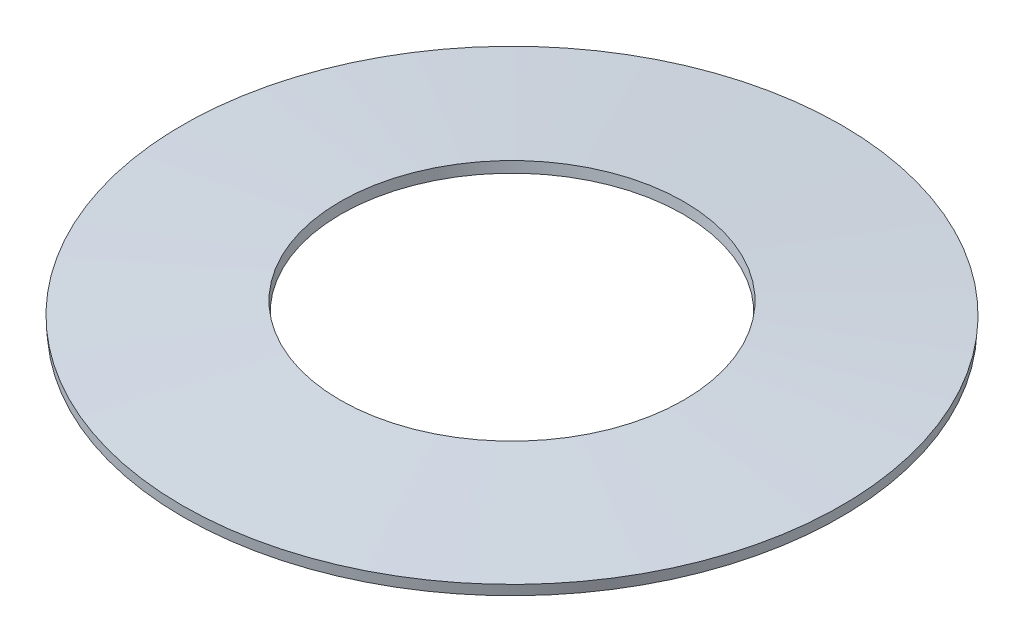
ISO-10303-21;
HEADER;
FILE_DESCRIPTION(('STEP AP214'),'2;1');
FILE_NAME('part.step','',(''),(''),'','','');
FILE_SCHEMA(('AUTOMOTIVE_DESIGN { 1 0 10303 214 1 1 1 1 }'));
ENDSEC;
DATA;
#1=APPLICATION_CONTEXT('core data for automotive mechanical design processes');
#2=APPLICATION_PROTOCOL_DEFINITION('international standard','automotive_design',2000,#1);
#3=PRODUCT_CONTEXT('',#1,'mechanical');
#4=PRODUCT('Part','Part','',(#3));
#5=PRODUCT_RELATED_PRODUCT_CATEGORY('part','',(#4));
#6=PRODUCT_DEFINITION_FORMATION('','',#4);
#7=PRODUCT_DEFINITION_CONTEXT('part definition',#1,'design');
#8=PRODUCT_DEFINITION('design','',#6,#7);
#9=PRODUCT_DEFINITION_SHAPE('','',#8);
#10=(LENGTH_UNIT() NAMED_UNIT(*) SI_UNIT(.MILLI.,.METRE.));
#11=(NAMED_UNIT(*) PLANE_ANGLE_UNIT() SI_UNIT($,.RADIAN.));
#12=(NAMED_UNIT(*) SI_UNIT($,.STERADIAN.) SOLID_ANGLE_UNIT());
#13=UNCERTAINTY_MEASURE_WITH_UNIT(LENGTH_MEASURE(1.E-05),#10,'distance_accuracy_value','');
#14=(GEOMETRIC_REPRESENTATION_CONTEXT(3) GLOBAL_UNCERTAINTY_ASSIGNED_CONTEXT((#13)) GLOBAL_UNIT_ASSIGNED_CONTEXT((#10,
#11,#12)) REPRESENTATION_CONTEXT('',''));
#15=CARTESIAN_POINT('',(0.,0.,0.));
#16=DIRECTION('',(0.,0.,1.));
#17=DIRECTION('',(1.,0.,0.));
#18=AXIS2_PLACEMENT_3D('',#15,#16,#17);
#19=CARTESIAN_POINT('',(0.,0.,0.));
#20=DIRECTION('',(0.,1.,0.));
#21=DIRECTION('',(0.,0.,1.));
#22=AXIS2_PLACEMENT_3D('',#19,#20,#21);
#23=CONICAL_SURFACE('',#22,7.88017020627382,0.0794025844507323);
#24=CARTESIAN_POINT('',(0.,0.249212317674661,0.));
#25=DIRECTION('',(0.,-1.,0.));
#26=DIRECTION('',(0.,0.,-1.));
#27=AXIS2_PLACEMENT_3D('',#24,#25,#26);
#28=CIRCLE('',#27,7.9);
#29=CARTESIAN_POINT('',(0.,0.249212317674661,-7.9));
#30=VERTEX_POINT('',#29);
#31=EDGE_CURVE('E48',#30,#30,#28,.T.);
#32=ORIENTED_EDGE('',*,*,#31,.T.);
#33=EDGE_LOOP('',(#32));
#34=FACE_BOUND('',#33,.T.);
#35=CARTESIAN_POINT('',(0.,0.,0.));
#36=DIRECTION('',(0.,-1.,0.));
#37=DIRECTION('',(0.,0.,-1.));
#38=AXIS2_PLACEMENT_3D('',#35,#36,#37);
#39=CIRCLE('',#38,7.88017020627382);
#40=CARTESIAN_POINT('',(0.,0.,-7.88017020627382));
#41=VERTEX_POINT('',#40);
#42=EDGE_CURVE('E10',#41,#41,#39,.T.);
#43=ORIENTED_EDGE('',*,*,#42,.F.);
#44=EDGE_LOOP('',(#43));
#45=FACE_BOUND('',#44,.T.);
#46=ADVANCED_FACE('F34',(#34,#45),#23,.T.);
#47=CARTESIAN_POINT('',(0.,0.300787682325335,0.));
#48=DIRECTION('',(0.,-1.,0.));
#49=DIRECTION('',(0.,0.,-1.));
#50=AXIS2_PLACEMENT_3D('',#47,#48,#49);
#51=CONICAL_SURFACE('',#50,4.1,1.49139374234414);
#52=ORIENTED_EDGE('',*,*,#42,.T.);
#53=EDGE_LOOP('',(#52));
#54=FACE_BOUND('',#53,.T.);
#55=CARTESIAN_POINT('',(0.,0.300787682325335,0.));
#56=DIRECTION('',(0.,-1.,0.));
#57=DIRECTION('',(0.,0.,-1.));
#58=AXIS2_PLACEMENT_3D('',#55,#56,#57);
#59=CIRCLE('',#58,4.1);
#60=CARTESIAN_POINT('',(0.,0.300787682325335,-4.1));
#61=VERTEX_POINT('',#60);
#62=EDGE_CURVE('E40',#61,#61,#59,.T.);
#63=ORIENTED_EDGE('',*,*,#62,.F.);
#64=EDGE_LOOP('',(#63));
#65=FACE_BOUND('',#64,.T.);
#66=ADVANCED_FACE('F64',(#54,#65),#51,.F.);
#67=CARTESIAN_POINT('',(0.,0.549999999999998,0.));
#68=DIRECTION('',(0.,1.,0.));
#69=DIRECTION('',(0.,0.,1.));
#70=AXIS2_PLACEMENT_3D('',#67,#68,#69);
#71=CONICAL_SURFACE('',#70,4.11982979372619,0.07940258445076);
#72=ORIENTED_EDGE('',*,*,#62,.T.);
#73=EDGE_LOOP('',(#72));
#74=FACE_BOUND('',#73,.T.);
#75=CARTESIAN_POINT('',(0.,0.549999999999998,0.));
#76=DIRECTION('',(0.,-1.,0.));
#77=DIRECTION('',(0.,0.,-1.));
#78=AXIS2_PLACEMENT_3D('',#75,#76,#77);
#79=CIRCLE('',#78,4.11982979372619);
#80=CARTESIAN_POINT('',(0.,0.549999999999998,-4.11982979372619));
#81=VERTEX_POINT('',#80);
#82=EDGE_CURVE('E44',#81,#81,#79,.T.);
#83=ORIENTED_EDGE('',*,*,#82,.F.);
#84=EDGE_LOOP('',(#83));
#85=FACE_BOUND('',#84,.T.);
#86=ADVANCED_FACE('F58',(#74,#85),#71,.F.);
#87=CARTESIAN_POINT('',(0.,0.249212317674661,0.));
#88=DIRECTION('',(0.,-1.,0.));
#89=DIRECTION('',(0.,0.,-1.));
#90=AXIS2_PLACEMENT_3D('',#87,#88,#89);
#91=CONICAL_SURFACE('',#90,7.9,1.49139374234414);
#92=ORIENTED_EDGE('',*,*,#82,.T.);
#93=EDGE_LOOP('',(#92));
#94=FACE_BOUND('',#93,.T.);
#95=ORIENTED_EDGE('',*,*,#31,.F.);
#96=EDGE_LOOP('',(#95));
#97=FACE_BOUND('',#96,.T.);
#98=ADVANCED_FACE('F56',(#94,#97),#91,.T.);
#99=CLOSED_SHELL('',(#46,#66,#86,#98));
#100=MANIFOLD_SOLID_BREP('B2',#99);
#101=ADVANCED_BREP_SHAPE_REPRESENTATION('',(#18,#100),#14);
#102=SHAPE_DEFINITION_REPRESENTATION(#9,#101);
ENDSEC;
END-ISO-10303-21;
